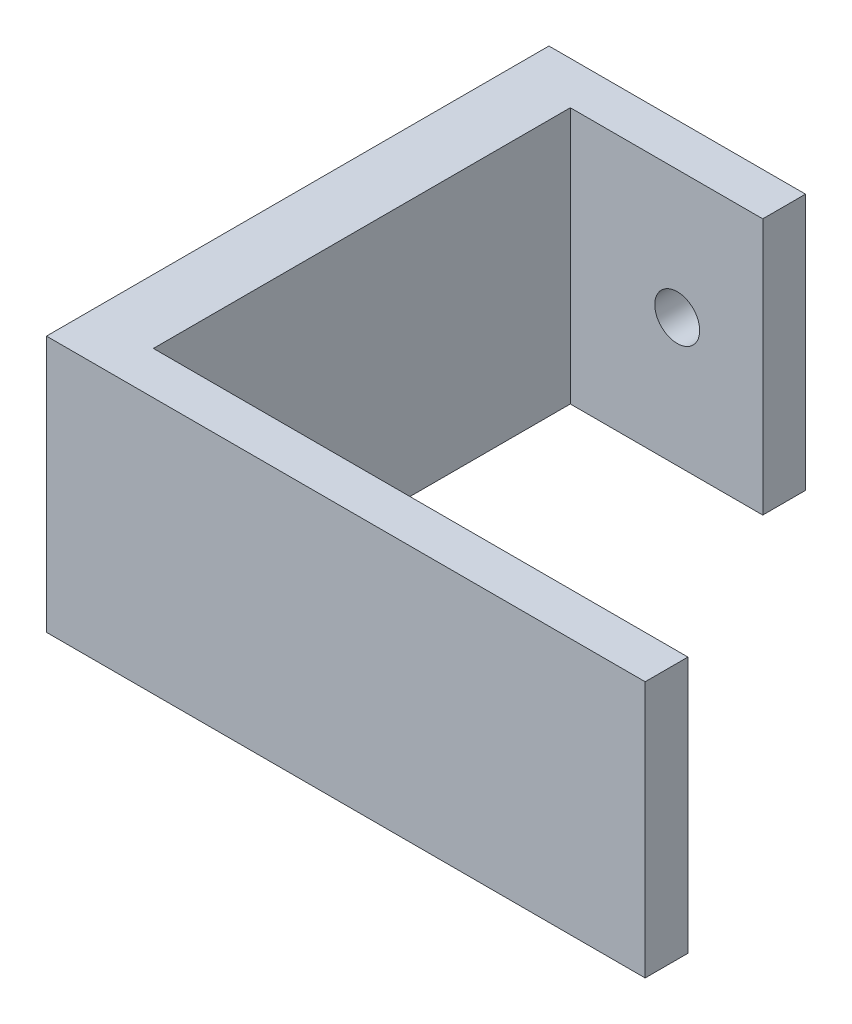
ISO-10303-21;
HEADER;
FILE_DESCRIPTION(('STEP AP214'),'2;1');
FILE_NAME('part.step','',(''),(''),'','','');
FILE_SCHEMA(('AUTOMOTIVE_DESIGN { 1 0 10303 214 1 1 1 1 }'));
ENDSEC;
DATA;
#1=APPLICATION_CONTEXT('core data for automotive mechanical design processes');
#2=APPLICATION_PROTOCOL_DEFINITION('international standard','automotive_design',2000,#1);
#3=PRODUCT_CONTEXT('',#1,'mechanical');
#4=PRODUCT('Part','Part','',(#3));
#5=PRODUCT_RELATED_PRODUCT_CATEGORY('part','',(#4));
#6=PRODUCT_DEFINITION_FORMATION('','',#4);
#7=PRODUCT_DEFINITION_CONTEXT('part definition',#1,'design');
#8=PRODUCT_DEFINITION('design','',#6,#7);
#9=PRODUCT_DEFINITION_SHAPE('','',#8);
#10=(LENGTH_UNIT() NAMED_UNIT(*) SI_UNIT(.MILLI.,.METRE.));
#11=(NAMED_UNIT(*) PLANE_ANGLE_UNIT() SI_UNIT($,.RADIAN.));
#12=(NAMED_UNIT(*) SI_UNIT($,.STERADIAN.) SOLID_ANGLE_UNIT());
#13=UNCERTAINTY_MEASURE_WITH_UNIT(LENGTH_MEASURE(1.E-05),#10,'distance_accuracy_value','');
#14=(GEOMETRIC_REPRESENTATION_CONTEXT(3) GLOBAL_UNCERTAINTY_ASSIGNED_CONTEXT((#13)) GLOBAL_UNIT_ASSIGNED_CONTEXT((#10,
#11,#12)) REPRESENTATION_CONTEXT('',''));
#15=CARTESIAN_POINT('',(0.,0.,0.));
#16=DIRECTION('',(0.,0.,1.));
#17=DIRECTION('',(1.,0.,0.));
#18=AXIS2_PLACEMENT_3D('',#15,#16,#17);
#19=CARTESIAN_POINT('',(0.,0.,-21.5));
#20=DIRECTION('',(0.,0.,-1.));
#21=DIRECTION('',(-1.,0.,0.));
#22=AXIS2_PLACEMENT_3D('',#19,#20,#21);
#23=PLANE('',#22);
#24=CARTESIAN_POINT('',(-36.,-20.,-21.5));
#25=DIRECTION('',(0.,0.,1.));
#26=DIRECTION('',(1.,0.,0.));
#27=AXIS2_PLACEMENT_3D('',#24,#25,#26);
#28=CIRCLE('',#27,1.05);
#29=CARTESIAN_POINT('',(-34.95,-20.,-21.5));
#30=VERTEX_POINT('',#29);
#31=EDGE_CURVE('E144',#30,#30,#28,.T.);
#32=ORIENTED_EDGE('',*,*,#31,.F.);
#33=EDGE_LOOP('',(#32));
#34=FACE_BOUND('',#33,.T.);
#35=DIRECTION('',(0.,1.,0.));
#36=VECTOR('',#35,1.);
#37=CARTESIAN_POINT('',(-41.,0.,-21.5));
#38=LINE('',#37,#36);
#39=CARTESIAN_POINT('',(-41.,-26.,-21.5));
#40=VERTEX_POINT('',#39);
#41=CARTESIAN_POINT('',(-41.,-14.,-21.5));
#42=VERTEX_POINT('',#41);
#43=EDGE_CURVE('E50',#40,#42,#38,.T.);
#44=ORIENTED_EDGE('',*,*,#43,.F.);
#45=DIRECTION('',(1.,0.,0.));
#46=VECTOR('',#45,1.);
#47=CARTESIAN_POINT('',(-44.,-26.,-21.5));
#48=LINE('',#47,#46);
#49=CARTESIAN_POINT('',(-32.,-26.,-21.5));
#50=VERTEX_POINT('',#49);
#51=EDGE_CURVE('E147',#40,#50,#48,.T.);
#52=ORIENTED_EDGE('',*,*,#51,.T.);
#53=DIRECTION('',(0.,1.,0.));
#54=VECTOR('',#53,1.);
#55=CARTESIAN_POINT('',(-32.,-26.,-21.5));
#56=LINE('',#55,#54);
#57=CARTESIAN_POINT('',(-32.,-14.,-21.5));
#58=VERTEX_POINT('',#57);
#59=EDGE_CURVE('E155',#50,#58,#56,.T.);
#60=ORIENTED_EDGE('',*,*,#59,.T.);
#61=DIRECTION('',(-1.,0.,0.));
#62=VECTOR('',#61,1.);
#63=CARTESIAN_POINT('',(-44.,-14.,-21.5));
#64=LINE('',#63,#62);
#65=EDGE_CURVE('E154',#58,#42,#64,.T.);
#66=ORIENTED_EDGE('',*,*,#65,.T.);
#67=EDGE_LOOP('',(#44,#52,#60,#66));
#68=FACE_BOUND('',#67,.T.);
#69=ADVANCED_FACE('F39',(#34,#68),#23,.F.);
#70=CARTESIAN_POINT('',(0.,0.,-23.5));
#71=DIRECTION('',(0.,0.,-1.));
#72=DIRECTION('',(-1.,0.,0.));
#73=AXIS2_PLACEMENT_3D('',#70,#71,#72);
#74=PLANE('',#73);
#75=DIRECTION('',(0.,-1.,0.));
#76=VECTOR('',#75,1.);
#77=CARTESIAN_POINT('',(-44.,-26.,-23.5));
#78=LINE('',#77,#76);
#79=CARTESIAN_POINT('',(-44.,-14.,-23.5));
#80=VERTEX_POINT('',#79);
#81=CARTESIAN_POINT('',(-44.,-26.,-23.5));
#82=VERTEX_POINT('',#81);
#83=EDGE_CURVE('E108',#80,#82,#78,.T.);
#84=ORIENTED_EDGE('',*,*,#83,.F.);
#85=DIRECTION('',(-1.,0.,0.));
#86=VECTOR('',#85,1.);
#87=CARTESIAN_POINT('',(-44.,-14.,-23.5));
#88=LINE('',#87,#86);
#89=CARTESIAN_POINT('',(-32.,-14.,-23.5));
#90=VERTEX_POINT('',#89);
#91=EDGE_CURVE('E153',#90,#80,#88,.T.);
#92=ORIENTED_EDGE('',*,*,#91,.F.);
#93=DIRECTION('',(0.,1.,0.));
#94=VECTOR('',#93,1.);
#95=CARTESIAN_POINT('',(-32.,-26.,-23.5));
#96=LINE('',#95,#94);
#97=CARTESIAN_POINT('',(-32.,-26.,-23.5));
#98=VERTEX_POINT('',#97);
#99=EDGE_CURVE('E165',#98,#90,#96,.T.);
#100=ORIENTED_EDGE('',*,*,#99,.F.);
#101=DIRECTION('',(1.,0.,0.));
#102=VECTOR('',#101,1.);
#103=CARTESIAN_POINT('',(-44.,-26.,-23.5));
#104=LINE('',#103,#102);
#105=EDGE_CURVE('E159',#82,#98,#104,.T.);
#106=ORIENTED_EDGE('',*,*,#105,.F.);
#107=EDGE_LOOP('',(#84,#92,#100,#106));
#108=FACE_BOUND('',#107,.T.);
#109=CARTESIAN_POINT('',(-36.,-20.,-23.5));
#110=DIRECTION('',(0.,0.,1.));
#111=DIRECTION('',(1.,0.,0.));
#112=AXIS2_PLACEMENT_3D('',#109,#110,#111);
#113=CIRCLE('',#112,1.05);
#114=CARTESIAN_POINT('',(-34.95,-20.,-23.5));
#115=VERTEX_POINT('',#114);
#116=EDGE_CURVE('E145',#115,#115,#113,.T.);
#117=ORIENTED_EDGE('',*,*,#116,.T.);
#118=EDGE_LOOP('',(#117));
#119=FACE_BOUND('',#118,.T.);
#120=ADVANCED_FACE('F192',(#108,#119),#74,.T.);
#121=CARTESIAN_POINT('',(-44.,-26.,-21.5));
#122=DIRECTION('',(1.,0.,0.));
#123=DIRECTION('',(0.,0.,-1.));
#124=AXIS2_PLACEMENT_3D('',#121,#122,#123);
#125=PLANE('',#124);
#126=DIRECTION('',(0.,0.,-1.));
#127=VECTOR('',#126,1.);
#128=CARTESIAN_POINT('',(-44.,-14.,-21.5));
#129=LINE('',#128,#127);
#130=CARTESIAN_POINT('',(-44.,-14.,0.));
#131=VERTEX_POINT('',#130);
#132=EDGE_CURVE('E158',#131,#80,#129,.T.);
#133=ORIENTED_EDGE('',*,*,#132,.T.);
#134=ORIENTED_EDGE('',*,*,#83,.T.);
#135=DIRECTION('',(0.,0.,-1.));
#136=VECTOR('',#135,1.);
#137=CARTESIAN_POINT('',(-44.,-26.,-21.5));
#138=LINE('',#137,#136);
#139=CARTESIAN_POINT('',(-44.,-26.,0.));
#140=VERTEX_POINT('',#139);
#141=EDGE_CURVE('E102',#140,#82,#138,.T.);
#142=ORIENTED_EDGE('',*,*,#141,.F.);
#143=DIRECTION('',(0.,-1.,0.));
#144=VECTOR('',#143,1.);
#145=CARTESIAN_POINT('',(-44.,-26.,0.));
#146=LINE('',#145,#144);
#147=EDGE_CURVE('E110',#131,#140,#146,.T.);
#148=ORIENTED_EDGE('',*,*,#147,.F.);
#149=EDGE_LOOP('',(#133,#134,#142,#148));
#150=FACE_BOUND('',#149,.T.);
#151=ADVANCED_FACE('F41',(#150),#125,.F.);
#152=CARTESIAN_POINT('',(-44.,-26.,-21.5));
#153=DIRECTION('',(0.,1.,0.));
#154=DIRECTION('',(0.,0.,1.));
#155=AXIS2_PLACEMENT_3D('',#152,#153,#154);
#156=PLANE('',#155);
#157=DIRECTION('',(0.,0.,-1.));
#158=VECTOR('',#157,1.);
#159=CARTESIAN_POINT('',(-41.,-26.,-1.));
#160=LINE('',#159,#158);
#161=CARTESIAN_POINT('',(-41.,-26.,-2.));
#162=VERTEX_POINT('',#161);
#163=EDGE_CURVE('E58',#162,#40,#160,.T.);
#164=ORIENTED_EDGE('',*,*,#163,.F.);
#165=DIRECTION('',(1.,0.,0.));
#166=VECTOR('',#165,1.);
#167=CARTESIAN_POINT('',(-44.,-26.,-2.));
#168=LINE('',#167,#166);
#169=CARTESIAN_POINT('',(-16.,-26.,-2.));
#170=VERTEX_POINT('',#169);
#171=EDGE_CURVE('E53',#162,#170,#168,.T.);
#172=ORIENTED_EDGE('',*,*,#171,.T.);
#173=DIRECTION('',(0.,0.,-1.));
#174=VECTOR('',#173,1.);
#175=CARTESIAN_POINT('',(-16.,-26.,0.));
#176=LINE('',#175,#174);
#177=CARTESIAN_POINT('',(-16.,-26.,0.));
#178=VERTEX_POINT('',#177);
#179=EDGE_CURVE('E118',#178,#170,#176,.T.);
#180=ORIENTED_EDGE('',*,*,#179,.F.);
#181=DIRECTION('',(1.,0.,0.));
#182=VECTOR('',#181,1.);
#183=CARTESIAN_POINT('',(-44.,-26.,0.));
#184=LINE('',#183,#182);
#185=EDGE_CURVE('E113',#140,#178,#184,.T.);
#186=ORIENTED_EDGE('',*,*,#185,.F.);
#187=ORIENTED_EDGE('',*,*,#141,.T.);
#188=ORIENTED_EDGE('',*,*,#105,.T.);
#189=DIRECTION('',(0.,0.,-1.));
#190=VECTOR('',#189,1.);
#191=CARTESIAN_POINT('',(-32.,-26.,-21.5));
#192=LINE('',#191,#190);
#193=EDGE_CURVE('E115',#50,#98,#192,.T.);
#194=ORIENTED_EDGE('',*,*,#193,.F.);
#195=ORIENTED_EDGE('',*,*,#51,.F.);
#196=EDGE_LOOP('',(#164,#172,#180,#186,#187,#188,#194,#195));
#197=FACE_BOUND('',#196,.T.);
#198=ADVANCED_FACE('F117',(#197),#156,.F.);
#199=CARTESIAN_POINT('',(-32.,-26.,-21.5));
#200=DIRECTION('',(-1.,0.,0.));
#201=DIRECTION('',(0.,0.,1.));
#202=AXIS2_PLACEMENT_3D('',#199,#200,#201);
#203=PLANE('',#202);
#204=ORIENTED_EDGE('',*,*,#99,.T.);
#205=DIRECTION('',(0.,0.,-1.));
#206=VECTOR('',#205,1.);
#207=CARTESIAN_POINT('',(-32.,-14.,-21.5));
#208=LINE('',#207,#206);
#209=EDGE_CURVE('E170',#58,#90,#208,.T.);
#210=ORIENTED_EDGE('',*,*,#209,.F.);
#211=ORIENTED_EDGE('',*,*,#59,.F.);
#212=ORIENTED_EDGE('',*,*,#193,.T.);
#213=EDGE_LOOP('',(#204,#210,#211,#212));
#214=FACE_BOUND('',#213,.T.);
#215=ADVANCED_FACE('F182',(#214),#203,.F.);
#216=CARTESIAN_POINT('',(-44.,-14.,-21.5));
#217=DIRECTION('',(0.,-1.,0.));
#218=DIRECTION('',(0.,0.,-1.));
#219=AXIS2_PLACEMENT_3D('',#216,#217,#218);
#220=PLANE('',#219);
#221=ORIENTED_EDGE('',*,*,#132,.F.);
#222=DIRECTION('',(-1.,0.,0.));
#223=VECTOR('',#222,1.);
#224=CARTESIAN_POINT('',(-44.,-14.,0.));
#225=LINE('',#224,#223);
#226=CARTESIAN_POINT('',(-16.,-14.,0.));
#227=VERTEX_POINT('',#226);
#228=EDGE_CURVE('E127',#227,#131,#225,.T.);
#229=ORIENTED_EDGE('',*,*,#228,.F.);
#230=DIRECTION('',(0.,0.,-1.));
#231=VECTOR('',#230,1.);
#232=CARTESIAN_POINT('',(-16.,-14.,0.));
#233=LINE('',#232,#231);
#234=CARTESIAN_POINT('',(-16.,-14.,-2.));
#235=VERTEX_POINT('',#234);
#236=EDGE_CURVE('E131',#227,#235,#233,.T.);
#237=ORIENTED_EDGE('',*,*,#236,.T.);
#238=DIRECTION('',(-1.,0.,0.));
#239=VECTOR('',#238,1.);
#240=CARTESIAN_POINT('',(-44.,-14.,-2.));
#241=LINE('',#240,#239);
#242=CARTESIAN_POINT('',(-41.,-14.,-2.));
#243=VERTEX_POINT('',#242);
#244=EDGE_CURVE('E130',#235,#243,#241,.T.);
#245=ORIENTED_EDGE('',*,*,#244,.T.);
#246=DIRECTION('',(0.,0.,-1.));
#247=VECTOR('',#246,1.);
#248=CARTESIAN_POINT('',(-41.,-14.,-1.));
#249=LINE('',#248,#247);
#250=EDGE_CURVE('E143',#243,#42,#249,.T.);
#251=ORIENTED_EDGE('',*,*,#250,.T.);
#252=ORIENTED_EDGE('',*,*,#65,.F.);
#253=ORIENTED_EDGE('',*,*,#209,.T.);
#254=ORIENTED_EDGE('',*,*,#91,.T.);
#255=EDGE_LOOP('',(#221,#229,#237,#245,#251,#252,#253,#254));
#256=FACE_BOUND('',#255,.T.);
#257=ADVANCED_FACE('F184',(#256),#220,.F.);
#258=CARTESIAN_POINT('',(-36.,-20.,-21.5));
#259=DIRECTION('',(0.,0.,-1.));
#260=DIRECTION('',(-1.,0.,0.));
#261=AXIS2_PLACEMENT_3D('',#258,#259,#260);
#262=CYLINDRICAL_SURFACE('',#261,1.05);
#263=ORIENTED_EDGE('',*,*,#31,.T.);
#264=EDGE_LOOP('',(#263));
#265=FACE_BOUND('',#264,.T.);
#266=ORIENTED_EDGE('',*,*,#116,.F.);
#267=EDGE_LOOP('',(#266));
#268=FACE_BOUND('',#267,.T.);
#269=ADVANCED_FACE('F197',(#265,#268),#262,.F.);
#270=CARTESIAN_POINT('',(-41.,-26.,-1.));
#271=DIRECTION('',(-1.,0.,0.));
#272=DIRECTION('',(0.,0.,1.));
#273=AXIS2_PLACEMENT_3D('',#270,#271,#272);
#274=PLANE('',#273);
#275=ORIENTED_EDGE('',*,*,#250,.F.);
#276=DIRECTION('',(0.,-1.,0.));
#277=VECTOR('',#276,1.);
#278=CARTESIAN_POINT('',(-41.,-26.,-2.));
#279=LINE('',#278,#277);
#280=EDGE_CURVE('E11',#243,#162,#279,.T.);
#281=ORIENTED_EDGE('',*,*,#280,.T.);
#282=ORIENTED_EDGE('',*,*,#163,.T.);
#283=ORIENTED_EDGE('',*,*,#43,.T.);
#284=EDGE_LOOP('',(#275,#281,#282,#283));
#285=FACE_BOUND('',#284,.T.);
#286=ADVANCED_FACE('F175',(#285),#274,.F.);
#287=CARTESIAN_POINT('',(0.,0.,-2.));
#288=DIRECTION('',(0.,0.,-1.));
#289=DIRECTION('',(-1.,0.,0.));
#290=AXIS2_PLACEMENT_3D('',#287,#288,#289);
#291=PLANE('',#290);
#292=ORIENTED_EDGE('',*,*,#280,.F.);
#293=ORIENTED_EDGE('',*,*,#244,.F.);
#294=DIRECTION('',(0.,1.,0.));
#295=VECTOR('',#294,1.);
#296=CARTESIAN_POINT('',(-16.,-26.,-2.));
#297=LINE('',#296,#295);
#298=EDGE_CURVE('E128',#170,#235,#297,.T.);
#299=ORIENTED_EDGE('',*,*,#298,.F.);
#300=ORIENTED_EDGE('',*,*,#171,.F.);
#301=EDGE_LOOP('',(#292,#293,#299,#300));
#302=FACE_BOUND('',#301,.T.);
#303=ADVANCED_FACE('F190',(#302),#291,.T.);
#304=CARTESIAN_POINT('',(-16.,-26.,0.));
#305=DIRECTION('',(-1.,0.,0.));
#306=DIRECTION('',(0.,0.,1.));
#307=AXIS2_PLACEMENT_3D('',#304,#305,#306);
#308=PLANE('',#307);
#309=ORIENTED_EDGE('',*,*,#298,.T.);
#310=ORIENTED_EDGE('',*,*,#236,.F.);
#311=DIRECTION('',(0.,1.,0.));
#312=VECTOR('',#311,1.);
#313=CARTESIAN_POINT('',(-16.,-26.,0.));
#314=LINE('',#313,#312);
#315=EDGE_CURVE('E122',#178,#227,#314,.T.);
#316=ORIENTED_EDGE('',*,*,#315,.F.);
#317=ORIENTED_EDGE('',*,*,#179,.T.);
#318=EDGE_LOOP('',(#309,#310,#316,#317));
#319=FACE_BOUND('',#318,.T.);
#320=ADVANCED_FACE('F189',(#319),#308,.F.);
#321=CARTESIAN_POINT('',(0.,0.,0.));
#322=DIRECTION('',(0.,0.,-1.));
#323=DIRECTION('',(-1.,0.,0.));
#324=AXIS2_PLACEMENT_3D('',#321,#322,#323);
#325=PLANE('',#324);
#326=ORIENTED_EDGE('',*,*,#147,.T.);
#327=ORIENTED_EDGE('',*,*,#185,.T.);
#328=ORIENTED_EDGE('',*,*,#315,.T.);
#329=ORIENTED_EDGE('',*,*,#228,.T.);
#330=EDGE_LOOP('',(#326,#327,#328,#329));
#331=FACE_BOUND('',#330,.T.);
#332=ADVANCED_FACE('F121',(#331),#325,.F.);
#333=CLOSED_SHELL('',(#69,#120,#151,#198,#215,#257,#269,#286,#303,#320,#332));
#334=MANIFOLD_SOLID_BREP('B2',#333);
#335=ADVANCED_BREP_SHAPE_REPRESENTATION('',(#18,#334),#14);
#336=SHAPE_DEFINITION_REPRESENTATION(#9,#335);
ENDSEC;
END-ISO-10303-21;
